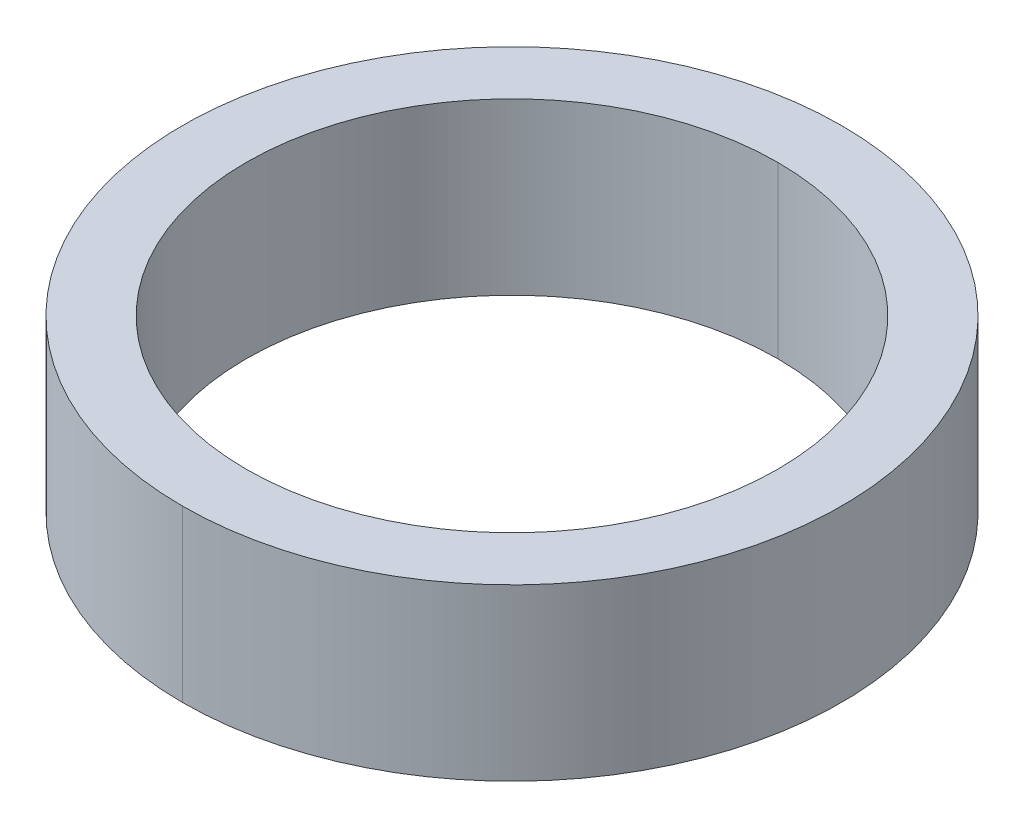
ISO-10303-21;
HEADER;
FILE_DESCRIPTION(('STEP AP214'),'2;1');
FILE_NAME('part.step','',(''),(''),'','','');
FILE_SCHEMA(('AUTOMOTIVE_DESIGN { 1 0 10303 214 1 1 1 1 }'));
ENDSEC;
DATA;
#1=APPLICATION_CONTEXT('core data for automotive mechanical design processes');
#2=APPLICATION_PROTOCOL_DEFINITION('international standard','automotive_design',2000,#1);
#3=PRODUCT_CONTEXT('',#1,'mechanical');
#4=PRODUCT('Part','Part','',(#3));
#5=PRODUCT_RELATED_PRODUCT_CATEGORY('part','',(#4));
#6=PRODUCT_DEFINITION_FORMATION('','',#4);
#7=PRODUCT_DEFINITION_CONTEXT('part definition',#1,'design');
#8=PRODUCT_DEFINITION('design','',#6,#7);
#9=PRODUCT_DEFINITION_SHAPE('','',#8);
#10=(LENGTH_UNIT() NAMED_UNIT(*) SI_UNIT(.MILLI.,.METRE.));
#11=(NAMED_UNIT(*) PLANE_ANGLE_UNIT() SI_UNIT($,.RADIAN.));
#12=(NAMED_UNIT(*) SI_UNIT($,.STERADIAN.) SOLID_ANGLE_UNIT());
#13=UNCERTAINTY_MEASURE_WITH_UNIT(LENGTH_MEASURE(1.E-05),#10,'distance_accuracy_value','');
#14=(GEOMETRIC_REPRESENTATION_CONTEXT(3) GLOBAL_UNCERTAINTY_ASSIGNED_CONTEXT((#13)) GLOBAL_UNIT_ASSIGNED_CONTEXT((#10,
#11,#12)) REPRESENTATION_CONTEXT('',''));
#15=CARTESIAN_POINT('',(0.,0.,0.));
#16=DIRECTION('',(0.,0.,1.));
#17=DIRECTION('',(1.,0.,0.));
#18=AXIS2_PLACEMENT_3D('',#15,#16,#17);
#19=CARTESIAN_POINT('',(-2.90698826646719,6.41171873202198,54.127124258992));
#20=DIRECTION('',(0.,-1.,0.));
#21=DIRECTION('',(0.,0.,1.));
#22=AXIS2_PLACEMENT_3D('',#19,#20,#21);
#23=CYLINDRICAL_SURFACE('',#22,6.25);
#24=DIRECTION('',(0.,-1.,0.));
#25=VECTOR('',#24,1.);
#26=CARTESIAN_POINT('',(-2.90698826646719,6.41171873202198,60.3771242589921));
#27=LINE('',#26,#25);
#28=CARTESIAN_POINT('',(-2.90698826646719,10.411718732022,60.3771242589921));
#29=VERTEX_POINT('',#28);
#30=CARTESIAN_POINT('',(-2.90698826646719,6.41171873202198,60.3771242589921));
#31=VERTEX_POINT('',#30);
#32=EDGE_CURVE('E77',#29,#31,#27,.T.);
#33=ORIENTED_EDGE('',*,*,#32,.F.);
#34=CARTESIAN_POINT('',(-2.90698826646719,10.411718732022,54.127124258992));
#35=DIRECTION('',(0.,-1.,0.));
#36=DIRECTION('',(0.,0.,-1.));
#37=AXIS2_PLACEMENT_3D('',#34,#35,#36);
#38=CIRCLE('',#37,6.25);
#39=CARTESIAN_POINT('',(-2.90698826646719,10.411718732022,47.877124258992));
#40=VERTEX_POINT('',#39);
#41=EDGE_CURVE('E65',#40,#29,#38,.T.);
#42=ORIENTED_EDGE('',*,*,#41,.F.);
#43=DIRECTION('',(0.,-1.,0.));
#44=VECTOR('',#43,1.);
#45=CARTESIAN_POINT('',(-2.90698826646719,6.41171873202198,47.877124258992));
#46=LINE('',#45,#44);
#47=CARTESIAN_POINT('',(-2.90698826646719,6.41171873202198,47.877124258992));
#48=VERTEX_POINT('',#47);
#49=EDGE_CURVE('E85',#40,#48,#46,.T.);
#50=ORIENTED_EDGE('',*,*,#49,.T.);
#51=CARTESIAN_POINT('',(-2.90698826646719,6.41171873202198,54.127124258992));
#52=DIRECTION('',(0.,-1.,0.));
#53=DIRECTION('',(0.,0.,-1.));
#54=AXIS2_PLACEMENT_3D('',#51,#52,#53);
#55=CIRCLE('',#54,6.25);
#56=EDGE_CURVE('E11',#48,#31,#55,.T.);
#57=ORIENTED_EDGE('',*,*,#56,.T.);
#58=EDGE_LOOP('',(#33,#42,#50,#57));
#59=FACE_BOUND('',#58,.T.);
#60=ADVANCED_FACE('F17',(#59),#23,.F.);
#61=CARTESIAN_POINT('',(-9.15698826646719,6.41171873202198,54.127124258992));
#62=DIRECTION('',(0.,1.,0.));
#63=DIRECTION('',(1.,0.,0.));
#64=AXIS2_PLACEMENT_3D('',#61,#62,#63);
#65=PLANE('',#64);
#66=ORIENTED_EDGE('',*,*,#56,.F.);
#67=CARTESIAN_POINT('',(-2.90698826646719,6.41171873202198,54.127124258992));
#68=DIRECTION('',(0.,-1.,0.));
#69=DIRECTION('',(0.,0.,-1.));
#70=AXIS2_PLACEMENT_3D('',#67,#68,#69);
#71=CIRCLE('',#70,6.25);
#72=EDGE_CURVE('E82',#31,#48,#71,.T.);
#73=ORIENTED_EDGE('',*,*,#72,.F.);
#74=EDGE_LOOP('',(#66,#73));
#75=FACE_BOUND('',#74,.T.);
#76=CARTESIAN_POINT('',(-2.90698826646719,6.41171873202198,54.127124258992));
#77=DIRECTION('',(0.,-1.,0.));
#78=DIRECTION('',(0.,0.,-1.));
#79=AXIS2_PLACEMENT_3D('',#76,#77,#78);
#80=CIRCLE('',#79,7.75);
#81=CARTESIAN_POINT('',(-2.90698826646719,6.41171873202198,46.377124258992));
#82=VERTEX_POINT('',#81);
#83=CARTESIAN_POINT('',(-2.90698826646719,6.41171873202198,61.8771242589921));
#84=VERTEX_POINT('',#83);
#85=EDGE_CURVE('E107',#82,#84,#80,.T.);
#86=ORIENTED_EDGE('',*,*,#85,.T.);
#87=CARTESIAN_POINT('',(-2.90698826646719,6.41171873202198,54.127124258992));
#88=DIRECTION('',(0.,-1.,0.));
#89=DIRECTION('',(0.,0.,-1.));
#90=AXIS2_PLACEMENT_3D('',#87,#88,#89);
#91=CIRCLE('',#90,7.75);
#92=EDGE_CURVE('E25',#84,#82,#91,.T.);
#93=ORIENTED_EDGE('',*,*,#92,.T.);
#94=EDGE_LOOP('',(#86,#93));
#95=FACE_BOUND('',#94,.T.);
#96=ADVANCED_FACE('F119',(#75,#95),#65,.F.);
#97=CARTESIAN_POINT('',(-2.90698826646719,6.41171873202198,54.127124258992));
#98=DIRECTION('',(0.,-1.,0.));
#99=DIRECTION('',(0.,0.,1.));
#100=AXIS2_PLACEMENT_3D('',#97,#98,#99);
#101=CYLINDRICAL_SURFACE('',#100,7.75);
#102=DIRECTION('',(0.,-1.,0.));
#103=VECTOR('',#102,1.);
#104=CARTESIAN_POINT('',(-2.90698826646719,6.41171873202198,61.8771242589921));
#105=LINE('',#104,#103);
#106=CARTESIAN_POINT('',(-2.90698826646719,10.411718732022,61.8771242589921));
#107=VERTEX_POINT('',#106);
#108=EDGE_CURVE('E96',#107,#84,#105,.T.);
#109=ORIENTED_EDGE('',*,*,#108,.F.);
#110=CARTESIAN_POINT('',(-2.90698826646719,10.411718732022,54.127124258992));
#111=DIRECTION('',(0.,-1.,0.));
#112=DIRECTION('',(0.,0.,-1.));
#113=AXIS2_PLACEMENT_3D('',#110,#111,#112);
#114=CIRCLE('',#113,7.75);
#115=CARTESIAN_POINT('',(-2.90698826646719,10.411718732022,46.377124258992));
#116=VERTEX_POINT('',#115);
#117=EDGE_CURVE('E75',#107,#116,#114,.T.);
#118=ORIENTED_EDGE('',*,*,#117,.T.);
#119=DIRECTION('',(0.,-1.,0.));
#120=VECTOR('',#119,1.);
#121=CARTESIAN_POINT('',(-2.90698826646719,6.41171873202198,46.377124258992));
#122=LINE('',#121,#120);
#123=EDGE_CURVE('E93',#116,#82,#122,.T.);
#124=ORIENTED_EDGE('',*,*,#123,.T.);
#125=ORIENTED_EDGE('',*,*,#92,.F.);
#126=EDGE_LOOP('',(#109,#118,#124,#125));
#127=FACE_BOUND('',#126,.T.);
#128=ADVANCED_FACE('F115',(#127),#101,.T.);
#129=CARTESIAN_POINT('',(-10.6569882664672,10.411718732022,54.127124258992));
#130=DIRECTION('',(0.,-1.,0.));
#131=DIRECTION('',(0.,0.,-1.));
#132=AXIS2_PLACEMENT_3D('',#129,#130,#131);
#133=PLANE('',#132);
#134=ORIENTED_EDGE('',*,*,#41,.T.);
#135=CARTESIAN_POINT('',(-2.90698826646719,10.411718732022,54.127124258992));
#136=DIRECTION('',(0.,-1.,0.));
#137=DIRECTION('',(0.,0.,-1.));
#138=AXIS2_PLACEMENT_3D('',#135,#136,#137);
#139=CIRCLE('',#138,6.25);
#140=EDGE_CURVE('E70',#29,#40,#139,.T.);
#141=ORIENTED_EDGE('',*,*,#140,.T.);
#142=EDGE_LOOP('',(#134,#141));
#143=FACE_BOUND('',#142,.T.);
#144=CARTESIAN_POINT('',(-2.90698826646719,10.411718732022,54.127124258992));
#145=DIRECTION('',(0.,-1.,0.));
#146=DIRECTION('',(0.,0.,-1.));
#147=AXIS2_PLACEMENT_3D('',#144,#145,#146);
#148=CIRCLE('',#147,7.75);
#149=EDGE_CURVE('E94',#116,#107,#148,.T.);
#150=ORIENTED_EDGE('',*,*,#149,.F.);
#151=ORIENTED_EDGE('',*,*,#117,.F.);
#152=EDGE_LOOP('',(#150,#151));
#153=FACE_BOUND('',#152,.T.);
#154=ADVANCED_FACE('F67',(#143,#153),#133,.F.);
#155=CARTESIAN_POINT('',(-2.90698826646719,6.41171873202198,54.127124258992));
#156=DIRECTION('',(0.,-1.,0.));
#157=DIRECTION('',(0.,0.,1.));
#158=AXIS2_PLACEMENT_3D('',#155,#156,#157);
#159=CYLINDRICAL_SURFACE('',#158,7.75);
#160=ORIENTED_EDGE('',*,*,#149,.T.);
#161=ORIENTED_EDGE('',*,*,#108,.T.);
#162=ORIENTED_EDGE('',*,*,#85,.F.);
#163=ORIENTED_EDGE('',*,*,#123,.F.);
#164=EDGE_LOOP('',(#160,#161,#162,#163));
#165=FACE_BOUND('',#164,.T.);
#166=ADVANCED_FACE('F118',(#165),#159,.T.);
#167=CARTESIAN_POINT('',(-2.90698826646719,6.41171873202198,54.127124258992));
#168=DIRECTION('',(0.,-1.,0.));
#169=DIRECTION('',(0.,0.,1.));
#170=AXIS2_PLACEMENT_3D('',#167,#168,#169);
#171=CYLINDRICAL_SURFACE('',#170,6.25);
#172=ORIENTED_EDGE('',*,*,#140,.F.);
#173=ORIENTED_EDGE('',*,*,#32,.T.);
#174=ORIENTED_EDGE('',*,*,#72,.T.);
#175=ORIENTED_EDGE('',*,*,#49,.F.);
#176=EDGE_LOOP('',(#172,#173,#174,#175));
#177=FACE_BOUND('',#176,.T.);
#178=ADVANCED_FACE('F84',(#177),#171,.F.);
#179=CLOSED_SHELL('',(#60,#96,#128,#154,#166,#178));
#180=MANIFOLD_SOLID_BREP('B1',#179);
#181=ADVANCED_BREP_SHAPE_REPRESENTATION('',(#18,#180),#14);
#182=SHAPE_DEFINITION_REPRESENTATION(#9,#181);
ENDSEC;
END-ISO-10303-21;
